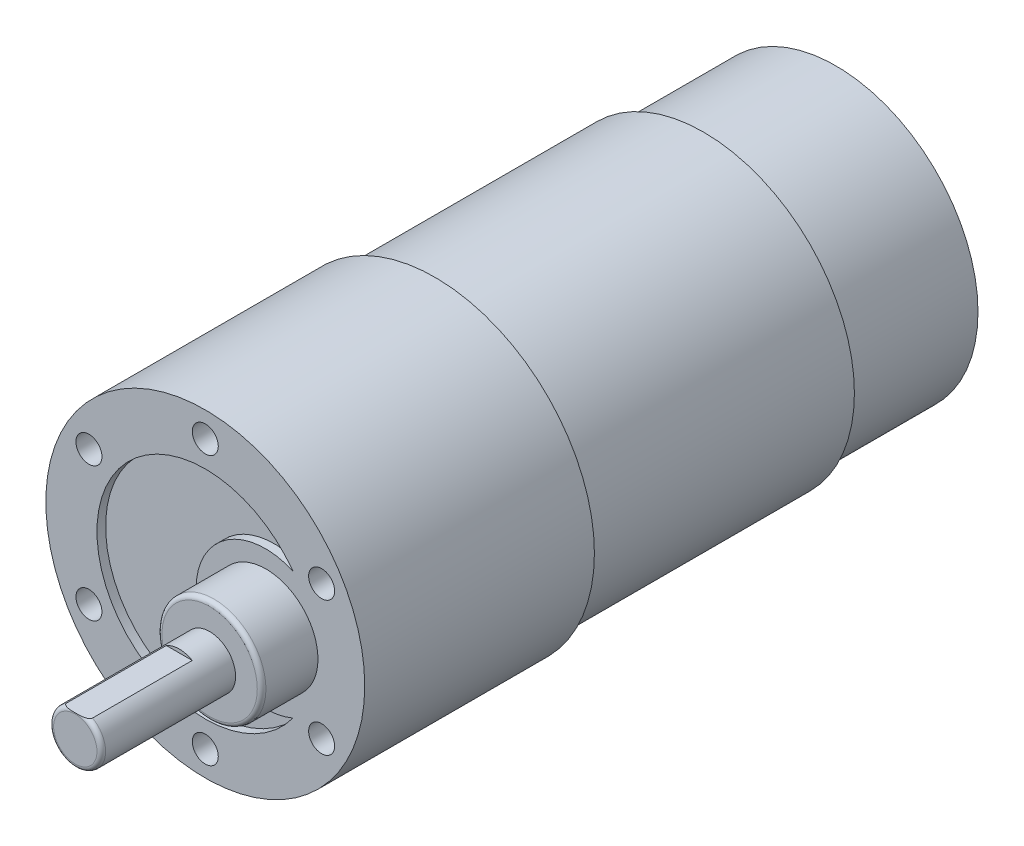
ISO-10303-21;
HEADER;
FILE_DESCRIPTION(('STEP AP214'),'2;1');
FILE_NAME('part.step','',(''),(''),'','','');
FILE_SCHEMA(('AUTOMOTIVE_DESIGN { 1 0 10303 214 1 1 1 1 }'));
ENDSEC;
DATA;
#1=APPLICATION_CONTEXT('core data for automotive mechanical design processes');
#2=APPLICATION_PROTOCOL_DEFINITION('international standard','automotive_design',2000,#1);
#3=PRODUCT_CONTEXT('',#1,'mechanical');
#4=PRODUCT('Part','Part','',(#3));
#5=PRODUCT_RELATED_PRODUCT_CATEGORY('part','',(#4));
#6=PRODUCT_DEFINITION_FORMATION('','',#4);
#7=PRODUCT_DEFINITION_CONTEXT('part definition',#1,'design');
#8=PRODUCT_DEFINITION('design','',#6,#7);
#9=PRODUCT_DEFINITION_SHAPE('','',#8);
#10=(LENGTH_UNIT() NAMED_UNIT(*) SI_UNIT(.MILLI.,.METRE.));
#11=(NAMED_UNIT(*) PLANE_ANGLE_UNIT() SI_UNIT($,.RADIAN.));
#12=(NAMED_UNIT(*) SI_UNIT($,.STERADIAN.) SOLID_ANGLE_UNIT());
#13=UNCERTAINTY_MEASURE_WITH_UNIT(LENGTH_MEASURE(1.E-05),#10,'distance_accuracy_value','');
#14=(GEOMETRIC_REPRESENTATION_CONTEXT(3) GLOBAL_UNCERTAINTY_ASSIGNED_CONTEXT((#13)) GLOBAL_UNIT_ASSIGNED_CONTEXT((#10,
#11,#12)) REPRESENTATION_CONTEXT('',''));
#15=CARTESIAN_POINT('',(0.,0.,0.));
#16=DIRECTION('',(0.,0.,1.));
#17=DIRECTION('',(1.,0.,0.));
#18=AXIS2_PLACEMENT_3D('',#15,#16,#17);
#19=CARTESIAN_POINT('',(0.,0.,-31.));
#20=DIRECTION('',(0.,0.,-1.));
#21=DIRECTION('',(-1.,0.,0.));
#22=AXIS2_PLACEMENT_3D('',#19,#20,#21);
#23=PLANE('',#22);
#24=CARTESIAN_POINT('',(0.,0.,-31.));
#25=DIRECTION('',(0.,0.,-1.));
#26=DIRECTION('',(-1.,0.,0.));
#27=AXIS2_PLACEMENT_3D('',#24,#25,#26);
#28=CIRCLE('',#27,16.4);
#29=CARTESIAN_POINT('',(-16.4,0.,-31.));
#30=VERTEX_POINT('',#29);
#31=EDGE_CURVE('E47',#30,#30,#28,.T.);
#32=ORIENTED_EDGE('',*,*,#31,.F.);
#33=EDGE_LOOP('',(#32));
#34=FACE_BOUND('',#33,.T.);
#35=CARTESIAN_POINT('',(0.,0.,-31.));
#36=DIRECTION('',(0.,0.,-1.));
#37=DIRECTION('',(-1.,0.,0.));
#38=AXIS2_PLACEMENT_3D('',#35,#36,#37);
#39=CIRCLE('',#38,17.4);
#40=CARTESIAN_POINT('',(-17.4,0.,-31.));
#41=VERTEX_POINT('',#40);
#42=EDGE_CURVE('E175',#41,#41,#39,.T.);
#43=ORIENTED_EDGE('',*,*,#42,.T.);
#44=EDGE_LOOP('',(#43));
#45=FACE_BOUND('',#44,.T.);
#46=ADVANCED_FACE('F39',(#34,#45),#23,.T.);
#47=CARTESIAN_POINT('',(0.,0.,26.5));
#48=DIRECTION('',(0.,0.,-1.));
#49=DIRECTION('',(-1.,0.,0.));
#50=AXIS2_PLACEMENT_3D('',#47,#48,#49);
#51=CYLINDRICAL_SURFACE('',#50,18.4);
#52=CARTESIAN_POINT('',(0.,0.,26.5));
#53=DIRECTION('',(0.,0.,1.));
#54=DIRECTION('',(1.,0.,0.));
#55=AXIS2_PLACEMENT_3D('',#52,#53,#54);
#56=CIRCLE('',#55,18.4);
#57=CARTESIAN_POINT('',(18.4,0.,26.5));
#58=VERTEX_POINT('',#57);
#59=EDGE_CURVE('E179',#58,#58,#56,.T.);
#60=ORIENTED_EDGE('',*,*,#59,.F.);
#61=EDGE_LOOP('',(#60));
#62=FACE_BOUND('',#61,.T.);
#63=CARTESIAN_POINT('',(0.,0.,0.));
#64=DIRECTION('',(0.,0.,1.));
#65=DIRECTION('',(1.,0.,0.));
#66=AXIS2_PLACEMENT_3D('',#63,#64,#65);
#67=CIRCLE('',#66,18.4);
#68=CARTESIAN_POINT('',(18.4,0.,0.));
#69=VERTEX_POINT('',#68);
#70=EDGE_CURVE('E178',#69,#69,#67,.T.);
#71=ORIENTED_EDGE('',*,*,#70,.T.);
#72=EDGE_LOOP('',(#71));
#73=FACE_BOUND('',#72,.T.);
#74=ADVANCED_FACE('F232',(#62,#73),#51,.T.);
#75=CARTESIAN_POINT('',(0.,0.,26.5));
#76=DIRECTION('',(0.,0.,1.));
#77=DIRECTION('',(1.,0.,0.));
#78=AXIS2_PLACEMENT_3D('',#75,#76,#77);
#79=PLANE('',#78);
#80=CARTESIAN_POINT('',(6.94021396000303,0.,26.5));
#81=DIRECTION('',(0.,0.,-1.));
#82=DIRECTION('',(1.,0.,0.));
#83=AXIS2_PLACEMENT_3D('',#80,#81,#82);
#84=CIRCLE('',#83,8.);
#85=CARTESIAN_POINT('',(10.116155684814,-7.34257408274541,26.5));
#86=VERTEX_POINT('',#85);
#87=CARTESIAN_POINT('',(10.116155684814,7.3425740827454,26.5));
#88=VERTEX_POINT('',#87);
#89=EDGE_CURVE('E106',#86,#88,#84,.T.);
#90=ORIENTED_EDGE('',*,*,#89,.F.);
#91=CARTESIAN_POINT('',(0.,0.,26.5));
#92=DIRECTION('',(0.,0.,1.));
#93=DIRECTION('',(1.,0.,0.));
#94=AXIS2_PLACEMENT_3D('',#91,#92,#93);
#95=CIRCLE('',#94,12.5);
#96=EDGE_CURVE('E116',#88,#86,#95,.T.);
#97=ORIENTED_EDGE('',*,*,#96,.F.);
#98=EDGE_LOOP('',(#90,#97));
#99=FACE_BOUND('',#98,.T.);
#100=CARTESIAN_POINT('',(-13.4233937586588,7.75,26.5));
#101=DIRECTION('',(0.,0.,1.));
#102=DIRECTION('',(1.,0.,0.));
#103=AXIS2_PLACEMENT_3D('',#100,#101,#102);
#104=CIRCLE('',#103,1.5);
#105=CARTESIAN_POINT('',(-11.9233937586588,7.75,26.5));
#106=VERTEX_POINT('',#105);
#107=EDGE_CURVE('E123',#106,#106,#104,.T.);
#108=ORIENTED_EDGE('',*,*,#107,.F.);
#109=EDGE_LOOP('',(#108));
#110=FACE_BOUND('',#109,.T.);
#111=CARTESIAN_POINT('',(-13.4233937586588,-7.75,26.5));
#112=DIRECTION('',(0.,0.,1.));
#113=DIRECTION('',(1.,0.,0.));
#114=AXIS2_PLACEMENT_3D('',#111,#112,#113);
#115=CIRCLE('',#114,1.5);
#116=CARTESIAN_POINT('',(-11.9233937586588,-7.75,26.5));
#117=VERTEX_POINT('',#116);
#118=EDGE_CURVE('E130',#117,#117,#115,.T.);
#119=ORIENTED_EDGE('',*,*,#118,.F.);
#120=EDGE_LOOP('',(#119));
#121=FACE_BOUND('',#120,.T.);
#122=CARTESIAN_POINT('',(0.,-15.5,26.5));
#123=DIRECTION('',(0.,0.,1.));
#124=DIRECTION('',(1.,0.,0.));
#125=AXIS2_PLACEMENT_3D('',#122,#123,#124);
#126=CIRCLE('',#125,1.5);
#127=CARTESIAN_POINT('',(1.5,-15.5,26.5));
#128=VERTEX_POINT('',#127);
#129=EDGE_CURVE('E136',#128,#128,#126,.T.);
#130=ORIENTED_EDGE('',*,*,#129,.F.);
#131=EDGE_LOOP('',(#130));
#132=FACE_BOUND('',#131,.T.);
#133=CARTESIAN_POINT('',(13.4233937586588,7.75,26.5));
#134=DIRECTION('',(0.,0.,1.));
#135=DIRECTION('',(1.,0.,0.));
#136=AXIS2_PLACEMENT_3D('',#133,#134,#135);
#137=CIRCLE('',#136,1.5);
#138=CARTESIAN_POINT('',(14.9233937586588,7.75,26.5));
#139=VERTEX_POINT('',#138);
#140=EDGE_CURVE('E142',#139,#139,#137,.T.);
#141=ORIENTED_EDGE('',*,*,#140,.F.);
#142=EDGE_LOOP('',(#141));
#143=FACE_BOUND('',#142,.T.);
#144=CARTESIAN_POINT('',(0.,15.5,26.5));
#145=DIRECTION('',(0.,0.,1.));
#146=DIRECTION('',(1.,0.,0.));
#147=AXIS2_PLACEMENT_3D('',#144,#145,#146);
#148=CIRCLE('',#147,1.5);
#149=CARTESIAN_POINT('',(1.5,15.5,26.5));
#150=VERTEX_POINT('',#149);
#151=EDGE_CURVE('E148',#150,#150,#148,.T.);
#152=ORIENTED_EDGE('',*,*,#151,.F.);
#153=EDGE_LOOP('',(#152));
#154=FACE_BOUND('',#153,.T.);
#155=CARTESIAN_POINT('',(13.4233937586588,-7.75,26.5));
#156=DIRECTION('',(0.,0.,1.));
#157=DIRECTION('',(1.,0.,0.));
#158=AXIS2_PLACEMENT_3D('',#155,#156,#157);
#159=CIRCLE('',#158,1.5);
#160=CARTESIAN_POINT('',(14.9233937586588,-7.75,26.5));
#161=VERTEX_POINT('',#160);
#162=EDGE_CURVE('E154',#161,#161,#159,.T.);
#163=ORIENTED_EDGE('',*,*,#162,.F.);
#164=EDGE_LOOP('',(#163));
#165=FACE_BOUND('',#164,.T.);
#166=CARTESIAN_POINT('',(7.,0.,26.5));
#167=DIRECTION('',(0.,0.,1.));
#168=DIRECTION('',(1.,0.,0.));
#169=AXIS2_PLACEMENT_3D('',#166,#167,#168);
#170=CIRCLE('',#169,6.);
#171=CARTESIAN_POINT('',(0.999999999999999,0.,26.5));
#172=VERTEX_POINT('',#171);
#173=EDGE_CURVE('E172',#172,#172,#170,.T.);
#174=ORIENTED_EDGE('',*,*,#173,.F.);
#175=EDGE_LOOP('',(#174));
#176=FACE_BOUND('',#175,.T.);
#177=ORIENTED_EDGE('',*,*,#59,.T.);
#178=EDGE_LOOP('',(#177));
#179=FACE_BOUND('',#178,.T.);
#180=ADVANCED_FACE('F238',(#99,#110,#121,#132,#143,#154,#165,#176,#179),#79,.T.);
#181=CARTESIAN_POINT('',(0.,0.,0.));
#182=DIRECTION('',(0.,0.,1.));
#183=DIRECTION('',(1.,0.,0.));
#184=AXIS2_PLACEMENT_3D('',#181,#182,#183);
#185=PLANE('',#184);
#186=CARTESIAN_POINT('',(0.,0.,0.));
#187=DIRECTION('',(0.,0.,1.));
#188=DIRECTION('',(1.,0.,0.));
#189=AXIS2_PLACEMENT_3D('',#186,#187,#188);
#190=CIRCLE('',#189,17.4);
#191=CARTESIAN_POINT('',(17.4,0.,0.));
#192=VERTEX_POINT('',#191);
#193=EDGE_CURVE('E182',#192,#192,#190,.F.);
#194=ORIENTED_EDGE('',*,*,#193,.F.);
#195=EDGE_LOOP('',(#194));
#196=FACE_BOUND('',#195,.T.);
#197=ORIENTED_EDGE('',*,*,#70,.F.);
#198=EDGE_LOOP('',(#197));
#199=FACE_BOUND('',#198,.T.);
#200=ADVANCED_FACE('F236',(#196,#199),#185,.F.);
#201=CARTESIAN_POINT('',(0.,0.,-31.));
#202=DIRECTION('',(0.,0.,1.));
#203=DIRECTION('',(1.,0.,0.));
#204=AXIS2_PLACEMENT_3D('',#201,#202,#203);
#205=CYLINDRICAL_SURFACE('',#204,17.4);
#206=ORIENTED_EDGE('',*,*,#42,.F.);
#207=EDGE_LOOP('',(#206));
#208=FACE_BOUND('',#207,.T.);
#209=ORIENTED_EDGE('',*,*,#193,.T.);
#210=EDGE_LOOP('',(#209));
#211=FACE_BOUND('',#210,.T.);
#212=ADVANCED_FACE('F228',(#208,#211),#205,.T.);
#213=CARTESIAN_POINT('',(7.,0.,33.));
#214=DIRECTION('',(0.,0.,-1.));
#215=DIRECTION('',(-1.,0.,0.));
#216=AXIS2_PLACEMENT_3D('',#213,#214,#215);
#217=CYLINDRICAL_SURFACE('',#216,6.);
#218=CARTESIAN_POINT('',(7.,0.,32.5));
#219=DIRECTION('',(0.,0.,1.));
#220=DIRECTION('',(1.,0.,0.));
#221=AXIS2_PLACEMENT_3D('',#218,#219,#220);
#222=CIRCLE('',#221,6.);
#223=CARTESIAN_POINT('',(0.999999999999999,0.,32.5));
#224=VERTEX_POINT('',#223);
#225=EDGE_CURVE('E190',#224,#224,#222,.F.);
#226=CARTESIAN_POINT('',(0.999999999999999,0.,32.5));
#227=CARTESIAN_POINT('',(0.999999999999999,0.,32.4375));
#228=CARTESIAN_POINT('',(0.999999999999999,0.,32.375));
#229=CARTESIAN_POINT('',(0.999999999999999,0.,32.25));
#230=CARTESIAN_POINT('',(0.999999999999999,0.,32.1875));
#231=CARTESIAN_POINT('',(0.999999999999999,0.,32.0625));
#232=CARTESIAN_POINT('',(0.999999999999999,0.,32.));
#233=CARTESIAN_POINT('',(0.999999999999999,0.,31.875));
#234=CARTESIAN_POINT('',(0.999999999999999,0.,31.8125));
#235=CARTESIAN_POINT('',(0.999999999999999,0.,31.6875));
#236=CARTESIAN_POINT('',(0.999999999999999,0.,31.625));
#237=CARTESIAN_POINT('',(0.999999999999999,0.,31.5));
#238=CARTESIAN_POINT('',(0.999999999999999,0.,31.4375));
#239=CARTESIAN_POINT('',(0.999999999999999,0.,31.3125));
#240=CARTESIAN_POINT('',(0.999999999999999,0.,31.25));
#241=CARTESIAN_POINT('',(0.999999999999999,0.,31.125));
#242=CARTESIAN_POINT('',(0.999999999999999,0.,31.0625));
#243=CARTESIAN_POINT('',(0.999999999999999,0.,30.9375));
#244=CARTESIAN_POINT('',(0.999999999999999,0.,30.875));
#245=CARTESIAN_POINT('',(0.999999999999999,0.,30.75));
#246=CARTESIAN_POINT('',(0.999999999999999,0.,30.6875));
#247=CARTESIAN_POINT('',(0.999999999999999,0.,30.5625));
#248=CARTESIAN_POINT('',(0.999999999999999,0.,30.5));
#249=CARTESIAN_POINT('',(0.999999999999999,0.,30.375));
#250=CARTESIAN_POINT('',(0.999999999999999,0.,30.3125));
#251=CARTESIAN_POINT('',(0.999999999999999,0.,30.1875));
#252=CARTESIAN_POINT('',(0.999999999999999,0.,30.125));
#253=CARTESIAN_POINT('',(0.999999999999999,0.,30.));
#254=CARTESIAN_POINT('',(0.999999999999999,0.,29.9375));
#255=CARTESIAN_POINT('',(0.999999999999999,0.,29.8125));
#256=CARTESIAN_POINT('',(0.999999999999999,0.,29.75));
#257=CARTESIAN_POINT('',(0.999999999999999,0.,29.625));
#258=CARTESIAN_POINT('',(0.999999999999999,0.,29.5625));
#259=CARTESIAN_POINT('',(0.999999999999999,0.,29.4375));
#260=CARTESIAN_POINT('',(0.999999999999999,0.,29.375));
#261=CARTESIAN_POINT('',(0.999999999999999,0.,29.25));
#262=CARTESIAN_POINT('',(0.999999999999999,0.,29.1875));
#263=CARTESIAN_POINT('',(0.999999999999999,0.,29.0625));
#264=CARTESIAN_POINT('',(0.999999999999999,0.,29.));
#265=CARTESIAN_POINT('',(0.999999999999999,0.,28.875));
#266=CARTESIAN_POINT('',(0.999999999999999,0.,28.8125));
#267=CARTESIAN_POINT('',(0.999999999999999,0.,28.6875));
#268=CARTESIAN_POINT('',(0.999999999999999,0.,28.625));
#269=CARTESIAN_POINT('',(0.999999999999999,0.,28.5));
#270=CARTESIAN_POINT('',(0.999999999999999,0.,28.4375));
#271=CARTESIAN_POINT('',(0.999999999999999,0.,28.3125));
#272=CARTESIAN_POINT('',(0.999999999999999,0.,28.25));
#273=CARTESIAN_POINT('',(0.999999999999999,0.,28.125));
#274=CARTESIAN_POINT('',(0.999999999999999,0.,28.0625));
#275=CARTESIAN_POINT('',(0.999999999999999,0.,27.9375));
#276=CARTESIAN_POINT('',(0.999999999999999,0.,27.875));
#277=CARTESIAN_POINT('',(0.999999999999999,0.,27.75));
#278=CARTESIAN_POINT('',(0.999999999999999,0.,27.6875));
#279=CARTESIAN_POINT('',(0.999999999999999,0.,27.5625));
#280=CARTESIAN_POINT('',(0.999999999999999,0.,27.5));
#281=CARTESIAN_POINT('',(0.999999999999999,0.,27.375));
#282=CARTESIAN_POINT('',(0.999999999999999,0.,27.3125));
#283=CARTESIAN_POINT('',(0.999999999999999,0.,27.1875));
#284=CARTESIAN_POINT('',(0.999999999999999,0.,27.125));
#285=CARTESIAN_POINT('',(0.999999999999999,0.,27.));
#286=CARTESIAN_POINT('',(0.999999999999999,0.,26.9375));
#287=CARTESIAN_POINT('',(0.999999999999999,0.,26.8125));
#288=CARTESIAN_POINT('',(0.999999999999999,0.,26.75));
#289=CARTESIAN_POINT('',(0.999999999999999,0.,26.625));
#290=CARTESIAN_POINT('',(0.999999999999999,0.,26.5625));
#291=CARTESIAN_POINT('',(0.999999999999999,0.,26.5));
#292=B_SPLINE_CURVE_WITH_KNOTS('',3,(#226,#227,#228,#229,#230,#231,#232,#233,#234,#235,#236,
#237,#238,#239,#240,#241,#242,#243,#244,#245,#246,#247,#248,#249,#250,#251,#252,#253,#254,#255,
#256,#257,#258,#259,#260,#261,#262,#263,#264,#265,#266,#267,#268,#269,#270,#271,#272,#273,#274,
#275,#276,#277,#278,#279,#280,#281,#282,#283,#284,#285,#286,#287,#288,#289,#290,#291),
.UNSPECIFIED.,.F.,.F.,(4,2,2,2,2,2,2,2,2,2,2,2,2,2,2,2,2,2,2,2,2,2,2,2,2,2,2,2,2,2,2,2,4),(0.,
0.187499999999993,0.374999999999993,0.562499999999994,0.749999999999994,0.937499999999994,
1.12499999999999,1.3125,1.5,1.68749999999999,1.87499999999999,2.06249999999999,2.25,2.4375,
2.625,2.8125,3.,3.1875,3.375,3.5625,3.75,3.9375,4.125,4.3125,4.5,4.6875,4.875,5.0625,5.25,
5.4375,5.62499999999999,5.81249999999999,5.99999999999999),.UNSPECIFIED.);
#293=EDGE_CURVE('BSEAM224',#224,#172,#292,.T.);
#294=ORIENTED_EDGE('',*,*,#225,.T.);
#295=ORIENTED_EDGE('',*,*,#173,.T.);
#296=ORIENTED_EDGE('',*,*,#293,.T.);
#297=ORIENTED_EDGE('',*,*,#293,.F.);
#298=EDGE_LOOP('',(#294,#296,#295,#297));
#299=FACE_BOUND('',#298,.T.);
#300=ADVANCED_FACE('F224',(#299),#217,.T.);
#301=CARTESIAN_POINT('',(7.,0.,33.));
#302=DIRECTION('',(0.,0.,1.));
#303=DIRECTION('',(1.,0.,0.));
#304=AXIS2_PLACEMENT_3D('',#301,#302,#303);
#305=PLANE('',#304);
#306=CARTESIAN_POINT('',(7.,0.,33.));
#307=DIRECTION('',(0.,0.,1.));
#308=DIRECTION('',(1.,0.,0.));
#309=AXIS2_PLACEMENT_3D('',#306,#307,#308);
#310=CIRCLE('',#309,3.);
#311=CARTESIAN_POINT('',(10.,0.,33.));
#312=VERTEX_POINT('',#311);
#313=EDGE_CURVE('E168',#312,#312,#310,.T.);
#314=ORIENTED_EDGE('',*,*,#313,.F.);
#315=EDGE_LOOP('',(#314));
#316=FACE_BOUND('',#315,.T.);
#317=CARTESIAN_POINT('',(7.,0.,33.));
#318=DIRECTION('',(0.,0.,1.));
#319=DIRECTION('',(1.,0.,0.));
#320=AXIS2_PLACEMENT_3D('',#317,#318,#319);
#321=CIRCLE('',#320,5.5);
#322=CARTESIAN_POINT('',(12.5,0.,33.));
#323=VERTEX_POINT('',#322);
#324=EDGE_CURVE('E187',#323,#323,#321,.T.);
#325=ORIENTED_EDGE('',*,*,#324,.T.);
#326=EDGE_LOOP('',(#325));
#327=FACE_BOUND('',#326,.T.);
#328=ADVANCED_FACE('F221',(#316,#327),#305,.T.);
#329=CARTESIAN_POINT('',(7.,0.,32.5));
#330=DIRECTION('',(0.,0.,1.));
#331=DIRECTION('',(1.,0.,0.));
#332=AXIS2_PLACEMENT_3D('',#329,#330,#331);
#333=TOROIDAL_SURFACE('',#332,5.5,0.5);
#334=ORIENTED_EDGE('',*,*,#225,.F.);
#335=EDGE_LOOP('',(#334));
#336=FACE_BOUND('',#335,.T.);
#337=ORIENTED_EDGE('',*,*,#324,.F.);
#338=EDGE_LOOP('',(#337));
#339=FACE_BOUND('',#338,.T.);
#340=ADVANCED_FACE('F219',(#336,#339),#333,.T.);
#341=CARTESIAN_POINT('',(7.,0.,48.5));
#342=DIRECTION('',(0.,0.,-1.));
#343=DIRECTION('',(-1.,0.,0.));
#344=AXIS2_PLACEMENT_3D('',#341,#342,#343);
#345=CYLINDRICAL_SURFACE('',#344,3.);
#346=DIRECTION('',(0.,0.,1.));
#347=VECTOR('',#346,1.);
#348=CARTESIAN_POINT('',(8.49666295470958,2.6,36.5));
#349=LINE('',#348,#347);
#350=CARTESIAN_POINT('',(8.49666295470958,2.6,36.5));
#351=VERTEX_POINT('',#350);
#352=CARTESIAN_POINT('',(8.49666295470958,2.6,47.9999999999998));
#353=VERTEX_POINT('',#352);
#354=EDGE_CURVE('E166',#351,#353,#349,.T.);
#355=ORIENTED_EDGE('',*,*,#354,.T.);
#356=CARTESIAN_POINT('',(7.,0.,48.));
#357=DIRECTION('',(0.,0.,1.));
#358=DIRECTION('',(1.,0.,0.));
#359=AXIS2_PLACEMENT_3D('',#356,#357,#358);
#360=CIRCLE('',#359,3.);
#361=CARTESIAN_POINT('',(5.50333704529042,2.6,48.));
#362=VERTEX_POINT('',#361);
#363=EDGE_CURVE('E194',#353,#362,#360,.F.);
#364=ORIENTED_EDGE('',*,*,#363,.T.);
#365=DIRECTION('',(0.,0.,1.));
#366=VECTOR('',#365,1.);
#367=CARTESIAN_POINT('',(5.50333704529042,2.6,36.5));
#368=LINE('',#367,#366);
#369=CARTESIAN_POINT('',(5.50333704529042,2.6,36.5));
#370=VERTEX_POINT('',#369);
#371=EDGE_CURVE('E165',#370,#362,#368,.T.);
#372=ORIENTED_EDGE('',*,*,#371,.F.);
#373=CARTESIAN_POINT('',(7.,0.,36.5));
#374=DIRECTION('',(0.,0.,1.));
#375=DIRECTION('',(1.,0.,0.));
#376=AXIS2_PLACEMENT_3D('',#373,#374,#375);
#377=CIRCLE('',#376,3.);
#378=EDGE_CURVE('E160',#351,#370,#377,.T.);
#379=ORIENTED_EDGE('',*,*,#378,.F.);
#380=EDGE_LOOP('',(#355,#364,#372,#379));
#381=FACE_BOUND('',#380,.T.);
#382=ORIENTED_EDGE('',*,*,#313,.T.);
#383=EDGE_LOOP('',(#382));
#384=FACE_BOUND('',#383,.T.);
#385=ADVANCED_FACE('F215',(#381,#384),#345,.T.);
#386=CARTESIAN_POINT('',(7.,0.,48.5));
#387=DIRECTION('',(0.,0.,1.));
#388=DIRECTION('',(1.,0.,0.));
#389=AXIS2_PLACEMENT_3D('',#386,#387,#388);
#390=PLANE('',#389);
#391=CARTESIAN_POINT('',(7.,0.,48.5));
#392=DIRECTION('',(0.,0.,1.));
#393=DIRECTION('',(1.,0.,0.));
#394=AXIS2_PLACEMENT_3D('',#391,#392,#393);
#395=CIRCLE('',#394,2.5);
#396=CARTESIAN_POINT('',(5.75278087107535,2.16666666666667,48.5));
#397=VERTEX_POINT('',#396);
#398=EDGE_CURVE('E52',#397,#397,#395,.T.);
#399=ORIENTED_EDGE('',*,*,#398,.T.);
#400=EDGE_LOOP('',(#399));
#401=FACE_BOUND('',#400,.T.);
#402=ADVANCED_FACE('F211',(#401),#390,.T.);
#403=CARTESIAN_POINT('',(5.50333704529042,2.6,36.5));
#404=DIRECTION('',(0.,-1.,0.));
#405=DIRECTION('',(0.,0.,-1.));
#406=AXIS2_PLACEMENT_3D('',#403,#404,#405);
#407=PLANE('',#406);
#408=ORIENTED_EDGE('',*,*,#371,.T.);
#409=CARTESIAN_POINT('',(5.50333704529042,2.6,48.));
#410=CARTESIAN_POINT('',(5.50330297182275,2.6,48.0149051021484));
#411=CARTESIAN_POINT('',(5.50467083675525,2.6,48.029774095933));
#412=CARTESIAN_POINT('',(5.50991444940275,2.6,48.0589406315826));
#413=CARTESIAN_POINT('',(5.51376915729006,2.6,48.0732419088318));
#414=CARTESIAN_POINT('',(5.52368575958067,2.6,48.1009976942714));
#415=CARTESIAN_POINT('',(5.52974166635573,2.6,48.1144543845247));
#416=CARTESIAN_POINT('',(5.54368448042331,2.6,48.1404029162101));
#417=CARTESIAN_POINT('',(5.55157537457962,2.6,48.1528925766694));
#418=CARTESIAN_POINT('',(5.57429481975214,2.6,48.1844102631289));
#419=CARTESIAN_POINT('',(5.59034743394957,2.6,48.2025553894644));
#420=CARTESIAN_POINT('',(5.62506502382319,2.6,48.23613599544));
#421=CARTESIAN_POINT('',(5.64373697250784,2.6,48.2515639860004));
#422=CARTESIAN_POINT('',(5.696688953828,2.6,48.2901504925236));
#423=CARTESIAN_POINT('',(5.7326295532227,2.6,48.3110092009974));
#424=CARTESIAN_POINT('',(5.80704280455868,2.6,48.347388756016));
#425=CARTESIAN_POINT('',(5.84552031433802,2.6,48.3628989852143));
#426=CARTESIAN_POINT('',(5.94098163922959,2.6,48.3958138881155));
#427=CARTESIAN_POINT('',(5.99869046576304,2.6,48.4110734988371));
#428=CARTESIAN_POINT('',(6.11533814692037,2.6,48.4360190476372));
#429=CARTESIAN_POINT('',(6.17427968032053,2.6,48.4456911693697));
#430=CARTESIAN_POINT('',(6.29303813238887,2.6,48.4612892459589));
#431=CARTESIAN_POINT('',(6.35285827463155,2.6,48.4671894614307));
#432=CARTESIAN_POINT('',(6.47261204277333,2.6,48.4764426430906));
#433=CARTESIAN_POINT('',(6.53254547527937,2.6,48.4797983644472));
#434=CARTESIAN_POINT('',(6.63969636030668,2.6,48.4843271761355));
#435=CARTESIAN_POINT('',(6.68690179857313,2.6,48.4858130032283));
#436=CARTESIAN_POINT('',(6.78133075287034,2.6,48.4880539304078));
#437=CARTESIAN_POINT('',(6.82855426943083,2.6,48.4888090071301));
#438=CARTESIAN_POINT('',(6.9230431065075,2.6,48.4897577844721));
#439=CARTESIAN_POINT('',(6.97030843099862,2.6,48.4899510485086));
#440=CARTESIAN_POINT('',(7.0648383568275,2.6,48.4898205958693));
#441=CARTESIAN_POINT('',(7.11210295816658,2.6,48.489496880295));
#442=CARTESIAN_POINT('',(7.20648900439623,2.6,48.4882580510872));
#443=CARTESIAN_POINT('',(7.25361047011958,2.6,48.4873446407243));
#444=CARTESIAN_POINT('',(7.3478307005282,2.6,48.4847313431131));
#445=CARTESIAN_POINT('',(7.39492946624152,2.6,48.4830314956639));
#446=CARTESIAN_POINT('',(7.48903220553244,2.6,48.4785275098704));
#447=CARTESIAN_POINT('',(7.53603622663395,2.6,48.4757244177043));
#448=CARTESIAN_POINT('',(7.62992254905967,2.6,48.4685656531621));
#449=CARTESIAN_POINT('',(7.67680487433774,2.6,48.4642103140601));
#450=CARTESIAN_POINT('',(7.76359650866925,2.6,48.4541263142836));
#451=CARTESIAN_POINT('',(7.80353833344609,2.6,48.4486855014514));
#452=CARTESIAN_POINT('',(7.88312201062598,2.6,48.4357295010266));
#453=CARTESIAN_POINT('',(7.92276364608334,2.6,48.4282129375471));
#454=CARTESIAN_POINT('',(8.00139823900069,2.6,48.410494115249));
#455=CARTESIAN_POINT('',(8.04039205130276,2.6,48.4002957543494));
#456=CARTESIAN_POINT('',(8.1172706415048,2.6,48.3763996298495));
#457=CARTESIAN_POINT('',(8.1551569510228,2.6,48.3627069813272));
#458=CARTESIAN_POINT('',(8.22944813861561,2.6,48.3305463184295));
#459=CARTESIAN_POINT('',(8.2658290549249,2.6,48.3120216232796));
#460=CARTESIAN_POINT('',(8.33470227153027,2.6,48.2688231560639));
#461=CARTESIAN_POINT('',(8.36722000464244,2.6,48.244193326085));
#462=CARTESIAN_POINT('',(8.40822324657555,2.6,48.2036284868606));
#463=CARTESIAN_POINT('',(8.41978987048696,2.6,48.190816953772));
#464=CARTESIAN_POINT('',(8.44109681949932,2.6,48.163731318176));
#465=CARTESIAN_POINT('',(8.45083729481483,2.6,48.1494573361155));
#466=CARTESIAN_POINT('',(8.46801249183189,2.6,48.1193494890491));
#467=CARTESIAN_POINT('',(8.47542073208243,2.6,48.1035002223719));
#468=CARTESIAN_POINT('',(8.48713863782567,2.6,48.0706994380282));
#469=CARTESIAN_POINT('',(8.49145442932524,2.6,48.053750172498));
#470=CARTESIAN_POINT('',(8.49627778271818,2.6,48.0208985771866));
#471=CARTESIAN_POINT('',(8.49709738041116,2.6,48.0050421628976));
#472=CARTESIAN_POINT('',(8.49575949781529,2.6,47.9733234598881));
#473=CARTESIAN_POINT('',(8.4935770468293,2.6,47.9574622324275));
#474=CARTESIAN_POINT('',(8.48987446930463,2.6,47.9419527308315));
#475=B_SPLINE_CURVE_WITH_KNOTS('',3,(#409,#410,#411,#412,#413,#414,#415,#416,#417,#418,#419,
#420,#421,#422,#423,#424,#425,#426,#427,#428,#429,#430,#431,#432,#433,#434,#435,#436,#437,#438,
#439,#440,#441,#442,#443,#444,#445,#446,#447,#448,#449,#450,#451,#452,#453,#454,#455,#456,#457,
#458,#459,#460,#461,#462,#463,#464,#465,#466,#467,#468,#469,#470,#471,#472,#473,#474),
.UNSPECIFIED.,.F.,.F.,(4,2,2,2,2,2,2,2,2,2,2,2,2,2,2,2,2,2,2,2,2,2,2,2,2,2,2,2,2,2,2,2,4),(0.,
0.0445952721647859,0.0888181097439598,0.132921543203815,0.177121710256437,0.249382432511188,
0.321839307557631,0.445797911195914,0.570001189161511,0.748597910004918,0.927634382412785,
1.1078799085406,1.28792998569448,1.42960976431829,1.57129407275093,1.71308845429779,
1.85488253373345,1.99626887743126,2.13764806682504,2.27889351181035,2.42010864904589,
2.54100078056764,2.66197323714652,2.78277082621243,2.903392591221,3.02549842069348,
3.14674968392238,3.19840665202864,3.25005936909162,3.30227902718043,3.35439495223901,
3.40174717858885,3.44949566606298),.UNSPECIFIED.);
#476=EDGE_CURVE('E59',#362,#353,#475,.T.);
#477=ORIENTED_EDGE('',*,*,#476,.T.);
#478=ORIENTED_EDGE('',*,*,#354,.F.);
#479=DIRECTION('',(1.,0.,0.));
#480=VECTOR('',#479,1.);
#481=CARTESIAN_POINT('',(5.50333704529042,2.6,36.5));
#482=LINE('',#481,#480);
#483=EDGE_CURVE('E162',#370,#351,#482,.T.);
#484=ORIENTED_EDGE('',*,*,#483,.F.);
#485=EDGE_LOOP('',(#408,#477,#478,#484));
#486=FACE_BOUND('',#485,.T.);
#487=ADVANCED_FACE('F205',(#486),#407,.F.);
#488=CARTESIAN_POINT('',(7.,0.,36.5));
#489=DIRECTION('',(0.,0.,1.));
#490=DIRECTION('',(1.,0.,0.));
#491=AXIS2_PLACEMENT_3D('',#488,#489,#490);
#492=PLANE('',#491);
#493=ORIENTED_EDGE('',*,*,#378,.T.);
#494=ORIENTED_EDGE('',*,*,#483,.T.);
#495=EDGE_LOOP('',(#493,#494));
#496=FACE_BOUND('',#495,.T.);
#497=ADVANCED_FACE('F210',(#496),#492,.T.);
#498=CARTESIAN_POINT('',(13.4233937586588,-7.75,23.5));
#499=DIRECTION('',(0.,0.,1.));
#500=DIRECTION('',(1.,0.,0.));
#501=AXIS2_PLACEMENT_3D('',#498,#499,#500);
#502=CONICAL_SURFACE('',#501,1.5,1.02974425867665);
#503=CARTESIAN_POINT('',(13.4233937586588,-7.75,22.5987090714587));
#504=VERTEX_POINT('',#503);
#505=VERTEX_LOOP('',#504);
#506=FACE_BOUND('',#505,.T.);
#507=CARTESIAN_POINT('',(13.4233937586588,-7.75,23.5));
#508=DIRECTION('',(0.,0.,1.));
#509=DIRECTION('',(1.,0.,0.));
#510=AXIS2_PLACEMENT_3D('',#507,#508,#509);
#511=CIRCLE('',#510,1.5);
#512=CARTESIAN_POINT('',(14.9233937586588,-7.75,23.5));
#513=VERTEX_POINT('',#512);
#514=EDGE_CURVE('E157',#513,#513,#511,.T.);
#515=ORIENTED_EDGE('',*,*,#514,.T.);
#516=EDGE_LOOP('',(#515));
#517=FACE_BOUND('',#516,.T.);
#518=ADVANCED_FACE('F283',(#506,#517),#502,.F.);
#519=CARTESIAN_POINT('',(13.4233937586588,-7.75,26.5));
#520=DIRECTION('',(0.,0.,1.));
#521=DIRECTION('',(1.,0.,0.));
#522=AXIS2_PLACEMENT_3D('',#519,#520,#521);
#523=CYLINDRICAL_SURFACE('',#522,1.5);
#524=ORIENTED_EDGE('',*,*,#514,.F.);
#525=EDGE_LOOP('',(#524));
#526=FACE_BOUND('',#525,.T.);
#527=ORIENTED_EDGE('',*,*,#162,.T.);
#528=EDGE_LOOP('',(#527));
#529=FACE_BOUND('',#528,.T.);
#530=ADVANCED_FACE('F290',(#526,#529),#523,.F.);
#531=CARTESIAN_POINT('',(0.,15.5,23.5));
#532=DIRECTION('',(0.,0.,1.));
#533=DIRECTION('',(1.,0.,0.));
#534=AXIS2_PLACEMENT_3D('',#531,#532,#533);
#535=CONICAL_SURFACE('',#534,1.5,1.02974425867665);
#536=CARTESIAN_POINT('',(0.,15.5,22.5987090714587));
#537=VERTEX_POINT('',#536);
#538=VERTEX_LOOP('',#537);
#539=FACE_BOUND('',#538,.T.);
#540=CARTESIAN_POINT('',(0.,15.5,23.5));
#541=DIRECTION('',(0.,0.,1.));
#542=DIRECTION('',(1.,0.,0.));
#543=AXIS2_PLACEMENT_3D('',#540,#541,#542);
#544=CIRCLE('',#543,1.5);
#545=CARTESIAN_POINT('',(1.5,15.5,23.5));
#546=VERTEX_POINT('',#545);
#547=EDGE_CURVE('E151',#546,#546,#544,.T.);
#548=ORIENTED_EDGE('',*,*,#547,.T.);
#549=EDGE_LOOP('',(#548));
#550=FACE_BOUND('',#549,.T.);
#551=ADVANCED_FACE('F297',(#539,#550),#535,.F.);
#552=CARTESIAN_POINT('',(0.,15.5,26.5));
#553=DIRECTION('',(0.,0.,1.));
#554=DIRECTION('',(1.,0.,0.));
#555=AXIS2_PLACEMENT_3D('',#552,#553,#554);
#556=CYLINDRICAL_SURFACE('',#555,1.5);
#557=ORIENTED_EDGE('',*,*,#547,.F.);
#558=EDGE_LOOP('',(#557));
#559=FACE_BOUND('',#558,.T.);
#560=ORIENTED_EDGE('',*,*,#151,.T.);
#561=EDGE_LOOP('',(#560));
#562=FACE_BOUND('',#561,.T.);
#563=ADVANCED_FACE('F305',(#559,#562),#556,.F.);
#564=CARTESIAN_POINT('',(13.4233937586588,7.75,23.5));
#565=DIRECTION('',(0.,0.,1.));
#566=DIRECTION('',(1.,0.,0.));
#567=AXIS2_PLACEMENT_3D('',#564,#565,#566);
#568=CONICAL_SURFACE('',#567,1.5,1.02974425867665);
#569=CARTESIAN_POINT('',(13.4233937586588,7.75,22.5987090714587));
#570=VERTEX_POINT('',#569);
#571=VERTEX_LOOP('',#570);
#572=FACE_BOUND('',#571,.T.);
#573=CARTESIAN_POINT('',(13.4233937586588,7.75,23.5));
#574=DIRECTION('',(0.,0.,1.));
#575=DIRECTION('',(1.,0.,0.));
#576=AXIS2_PLACEMENT_3D('',#573,#574,#575);
#577=CIRCLE('',#576,1.5);
#578=CARTESIAN_POINT('',(14.9233937586588,7.75,23.5));
#579=VERTEX_POINT('',#578);
#580=EDGE_CURVE('E145',#579,#579,#577,.T.);
#581=ORIENTED_EDGE('',*,*,#580,.T.);
#582=EDGE_LOOP('',(#581));
#583=FACE_BOUND('',#582,.T.);
#584=ADVANCED_FACE('F313',(#572,#583),#568,.F.);
#585=CARTESIAN_POINT('',(13.4233937586588,7.75,26.5));
#586=DIRECTION('',(0.,0.,1.));
#587=DIRECTION('',(1.,0.,0.));
#588=AXIS2_PLACEMENT_3D('',#585,#586,#587);
#589=CYLINDRICAL_SURFACE('',#588,1.5);
#590=ORIENTED_EDGE('',*,*,#580,.F.);
#591=EDGE_LOOP('',(#590));
#592=FACE_BOUND('',#591,.T.);
#593=ORIENTED_EDGE('',*,*,#140,.T.);
#594=EDGE_LOOP('',(#593));
#595=FACE_BOUND('',#594,.T.);
#596=ADVANCED_FACE('F321',(#592,#595),#589,.F.);
#597=CARTESIAN_POINT('',(0.,-15.5,23.5));
#598=DIRECTION('',(0.,0.,1.));
#599=DIRECTION('',(1.,0.,0.));
#600=AXIS2_PLACEMENT_3D('',#597,#598,#599);
#601=CONICAL_SURFACE('',#600,1.5,1.02974425867665);
#602=CARTESIAN_POINT('',(0.,-15.5,22.5987090714587));
#603=VERTEX_POINT('',#602);
#604=VERTEX_LOOP('',#603);
#605=FACE_BOUND('',#604,.T.);
#606=CARTESIAN_POINT('',(0.,-15.5,23.5));
#607=DIRECTION('',(0.,0.,1.));
#608=DIRECTION('',(1.,0.,0.));
#609=AXIS2_PLACEMENT_3D('',#606,#607,#608);
#610=CIRCLE('',#609,1.5);
#611=CARTESIAN_POINT('',(1.5,-15.5,23.5));
#612=VERTEX_POINT('',#611);
#613=EDGE_CURVE('E139',#612,#612,#610,.T.);
#614=ORIENTED_EDGE('',*,*,#613,.T.);
#615=EDGE_LOOP('',(#614));
#616=FACE_BOUND('',#615,.T.);
#617=ADVANCED_FACE('F329',(#605,#616),#601,.F.);
#618=CARTESIAN_POINT('',(0.,-15.5,26.5));
#619=DIRECTION('',(0.,0.,1.));
#620=DIRECTION('',(1.,0.,0.));
#621=AXIS2_PLACEMENT_3D('',#618,#619,#620);
#622=CYLINDRICAL_SURFACE('',#621,1.5);
#623=ORIENTED_EDGE('',*,*,#613,.F.);
#624=EDGE_LOOP('',(#623));
#625=FACE_BOUND('',#624,.T.);
#626=ORIENTED_EDGE('',*,*,#129,.T.);
#627=EDGE_LOOP('',(#626));
#628=FACE_BOUND('',#627,.T.);
#629=ADVANCED_FACE('F337',(#625,#628),#622,.F.);
#630=CARTESIAN_POINT('',(-13.4233937586588,-7.75,23.5));
#631=DIRECTION('',(0.,0.,1.));
#632=DIRECTION('',(1.,0.,0.));
#633=AXIS2_PLACEMENT_3D('',#630,#631,#632);
#634=CONICAL_SURFACE('',#633,1.5,1.02974425867665);
#635=CARTESIAN_POINT('',(-13.4233937586588,-7.75,22.5987090714587));
#636=VERTEX_POINT('',#635);
#637=VERTEX_LOOP('',#636);
#638=FACE_BOUND('',#637,.T.);
#639=CARTESIAN_POINT('',(-13.4233937586588,-7.75,23.5));
#640=DIRECTION('',(0.,0.,1.));
#641=DIRECTION('',(1.,0.,0.));
#642=AXIS2_PLACEMENT_3D('',#639,#640,#641);
#643=CIRCLE('',#642,1.5);
#644=CARTESIAN_POINT('',(-11.9233937586588,-7.75,23.5));
#645=VERTEX_POINT('',#644);
#646=EDGE_CURVE('E133',#645,#645,#643,.T.);
#647=ORIENTED_EDGE('',*,*,#646,.T.);
#648=EDGE_LOOP('',(#647));
#649=FACE_BOUND('',#648,.T.);
#650=ADVANCED_FACE('F345',(#638,#649),#634,.F.);
#651=CARTESIAN_POINT('',(-13.4233937586588,-7.75,26.5));
#652=DIRECTION('',(0.,0.,1.));
#653=DIRECTION('',(1.,0.,0.));
#654=AXIS2_PLACEMENT_3D('',#651,#652,#653);
#655=CYLINDRICAL_SURFACE('',#654,1.5);
#656=ORIENTED_EDGE('',*,*,#646,.F.);
#657=EDGE_LOOP('',(#656));
#658=FACE_BOUND('',#657,.T.);
#659=ORIENTED_EDGE('',*,*,#118,.T.);
#660=EDGE_LOOP('',(#659));
#661=FACE_BOUND('',#660,.T.);
#662=ADVANCED_FACE('F353',(#658,#661),#655,.F.);
#663=CARTESIAN_POINT('',(-13.4233937586588,7.75,23.5));
#664=DIRECTION('',(0.,0.,1.));
#665=DIRECTION('',(1.,0.,0.));
#666=AXIS2_PLACEMENT_3D('',#663,#664,#665);
#667=CONICAL_SURFACE('',#666,1.5,1.02974425867665);
#668=CARTESIAN_POINT('',(-13.4233937586588,7.75,22.5987090714587));
#669=VERTEX_POINT('',#668);
#670=VERTEX_LOOP('',#669);
#671=FACE_BOUND('',#670,.T.);
#672=CARTESIAN_POINT('',(-13.4233937586588,7.75,23.5));
#673=DIRECTION('',(0.,0.,1.));
#674=DIRECTION('',(1.,0.,0.));
#675=AXIS2_PLACEMENT_3D('',#672,#673,#674);
#676=CIRCLE('',#675,1.5);
#677=CARTESIAN_POINT('',(-11.9233937586588,7.75,23.5));
#678=VERTEX_POINT('',#677);
#679=EDGE_CURVE('E127',#678,#678,#676,.T.);
#680=ORIENTED_EDGE('',*,*,#679,.T.);
#681=EDGE_LOOP('',(#680));
#682=FACE_BOUND('',#681,.T.);
#683=ADVANCED_FACE('F361',(#671,#682),#667,.F.);
#684=CARTESIAN_POINT('',(-13.4233937586588,7.75,26.5));
#685=DIRECTION('',(0.,0.,1.));
#686=DIRECTION('',(1.,0.,0.));
#687=AXIS2_PLACEMENT_3D('',#684,#685,#686);
#688=CYLINDRICAL_SURFACE('',#687,1.5);
#689=ORIENTED_EDGE('',*,*,#679,.F.);
#690=EDGE_LOOP('',(#689));
#691=FACE_BOUND('',#690,.T.);
#692=ORIENTED_EDGE('',*,*,#107,.T.);
#693=EDGE_LOOP('',(#692));
#694=FACE_BOUND('',#693,.T.);
#695=ADVANCED_FACE('F369',(#691,#694),#688,.F.);
#696=CARTESIAN_POINT('',(6.94021396000303,0.,25.5));
#697=DIRECTION('',(0.,0.,1.));
#698=DIRECTION('',(1.,0.,0.));
#699=AXIS2_PLACEMENT_3D('',#696,#697,#698);
#700=CYLINDRICAL_SURFACE('',#699,8.);
#701=ORIENTED_EDGE('',*,*,#89,.T.);
#702=DIRECTION('',(0.,0.,1.));
#703=VECTOR('',#702,1.);
#704=CARTESIAN_POINT('',(10.116155684814,7.3425740827454,25.5));
#705=LINE('',#704,#703);
#706=CARTESIAN_POINT('',(10.116155684814,7.3425740827454,25.5));
#707=VERTEX_POINT('',#706);
#708=EDGE_CURVE('E100',#707,#88,#705,.T.);
#709=ORIENTED_EDGE('',*,*,#708,.F.);
#710=CARTESIAN_POINT('',(6.94021396000303,0.,25.5));
#711=DIRECTION('',(0.,0.,-1.));
#712=DIRECTION('',(1.,0.,0.));
#713=AXIS2_PLACEMENT_3D('',#710,#711,#712);
#714=CIRCLE('',#713,8.);
#715=CARTESIAN_POINT('',(10.116155684814,-7.34257408274541,25.5));
#716=VERTEX_POINT('',#715);
#717=EDGE_CURVE('E103',#716,#707,#714,.T.);
#718=ORIENTED_EDGE('',*,*,#717,.F.);
#719=DIRECTION('',(0.,0.,1.));
#720=VECTOR('',#719,1.);
#721=CARTESIAN_POINT('',(10.116155684814,-7.34257408274541,25.5));
#722=LINE('',#721,#720);
#723=EDGE_CURVE('E111',#716,#86,#722,.T.);
#724=ORIENTED_EDGE('',*,*,#723,.T.);
#725=EDGE_LOOP('',(#701,#709,#718,#724));
#726=FACE_BOUND('',#725,.T.);
#727=ADVANCED_FACE('F102',(#726),#700,.T.);
#728=CARTESIAN_POINT('',(0.,0.,25.5));
#729=DIRECTION('',(0.,0.,1.));
#730=DIRECTION('',(1.,0.,0.));
#731=AXIS2_PLACEMENT_3D('',#728,#729,#730);
#732=CYLINDRICAL_SURFACE('',#731,12.5);
#733=ORIENTED_EDGE('',*,*,#96,.T.);
#734=ORIENTED_EDGE('',*,*,#723,.F.);
#735=CARTESIAN_POINT('',(0.,0.,25.5));
#736=DIRECTION('',(0.,0.,1.));
#737=DIRECTION('',(1.,0.,0.));
#738=AXIS2_PLACEMENT_3D('',#735,#736,#737);
#739=CIRCLE('',#738,12.5);
#740=EDGE_CURVE('E112',#707,#716,#739,.T.);
#741=ORIENTED_EDGE('',*,*,#740,.F.);
#742=ORIENTED_EDGE('',*,*,#708,.T.);
#743=EDGE_LOOP('',(#733,#734,#741,#742));
#744=FACE_BOUND('',#743,.T.);
#745=ADVANCED_FACE('F118',(#744),#732,.F.);
#746=CARTESIAN_POINT('',(3.47010698000152,0.,25.5));
#747=DIRECTION('',(0.,0.,1.));
#748=DIRECTION('',(1.,0.,0.));
#749=AXIS2_PLACEMENT_3D('',#746,#747,#748);
#750=PLANE('',#749);
#751=ORIENTED_EDGE('',*,*,#717,.T.);
#752=ORIENTED_EDGE('',*,*,#740,.T.);
#753=EDGE_LOOP('',(#751,#752));
#754=FACE_BOUND('',#753,.T.);
#755=ADVANCED_FACE('F115',(#754),#750,.T.);
#756=CARTESIAN_POINT('',(7.,0.,48.));
#757=DIRECTION('',(0.,0.,1.));
#758=DIRECTION('',(1.,0.,0.));
#759=AXIS2_PLACEMENT_3D('',#756,#757,#758);
#760=TOROIDAL_SURFACE('',#759,2.5,0.5);
#761=ORIENTED_EDGE('',*,*,#476,.F.);
#762=ORIENTED_EDGE('',*,*,#363,.F.);
#763=EDGE_LOOP('',(#761,#762));
#764=FACE_BOUND('',#763,.T.);
#765=ORIENTED_EDGE('',*,*,#398,.F.);
#766=EDGE_LOOP('',(#765));
#767=FACE_BOUND('',#766,.T.);
#768=ADVANCED_FACE('F202',(#764,#767),#760,.T.);
#769=CARTESIAN_POINT('',(0.,0.,-46.26));
#770=DIRECTION('',(0.,0.,1.));
#771=DIRECTION('',(1.,0.,0.));
#772=AXIS2_PLACEMENT_3D('',#769,#770,#771);
#773=CYLINDRICAL_SURFACE('',#772,16.4);
#774=CARTESIAN_POINT('',(0.,0.,-46.26));
#775=DIRECTION('',(0.,0.,-1.));
#776=DIRECTION('',(-1.,0.,0.));
#777=AXIS2_PLACEMENT_3D('',#774,#775,#776);
#778=CIRCLE('',#777,16.4);
#779=CARTESIAN_POINT('',(-16.4,0.,-46.26));
#780=VERTEX_POINT('',#779);
#781=EDGE_CURVE('E11',#780,#780,#778,.T.);
#782=ORIENTED_EDGE('',*,*,#781,.F.);
#783=EDGE_LOOP('',(#782));
#784=FACE_BOUND('',#783,.T.);
#785=ORIENTED_EDGE('',*,*,#31,.T.);
#786=EDGE_LOOP('',(#785));
#787=FACE_BOUND('',#786,.T.);
#788=ADVANCED_FACE('F41',(#784,#787),#773,.T.);
#789=CARTESIAN_POINT('',(0.,0.,-46.26));
#790=DIRECTION('',(0.,0.,-1.));
#791=DIRECTION('',(-1.,0.,0.));
#792=AXIS2_PLACEMENT_3D('',#789,#790,#791);
#793=PLANE('',#792);
#794=ORIENTED_EDGE('',*,*,#781,.T.);
#795=EDGE_LOOP('',(#794));
#796=FACE_BOUND('',#795,.T.);
#797=ADVANCED_FACE('F408',(#796),#793,.T.);
#798=CLOSED_SHELL('',(#46,#74,#180,#200,#212,#300,#328,#340,#385,#402,#487,#497,#518,#530,#551,
#563,#584,#596,#617,#629,#650,#662,#683,#695,#727,#745,#755,#768,#788,#797));
#799=MANIFOLD_SOLID_BREP('B2',#798);
#800=ADVANCED_BREP_SHAPE_REPRESENTATION('',(#18,#799),#14);
#801=SHAPE_DEFINITION_REPRESENTATION(#9,#800);
ENDSEC;
END-ISO-10303-21;
